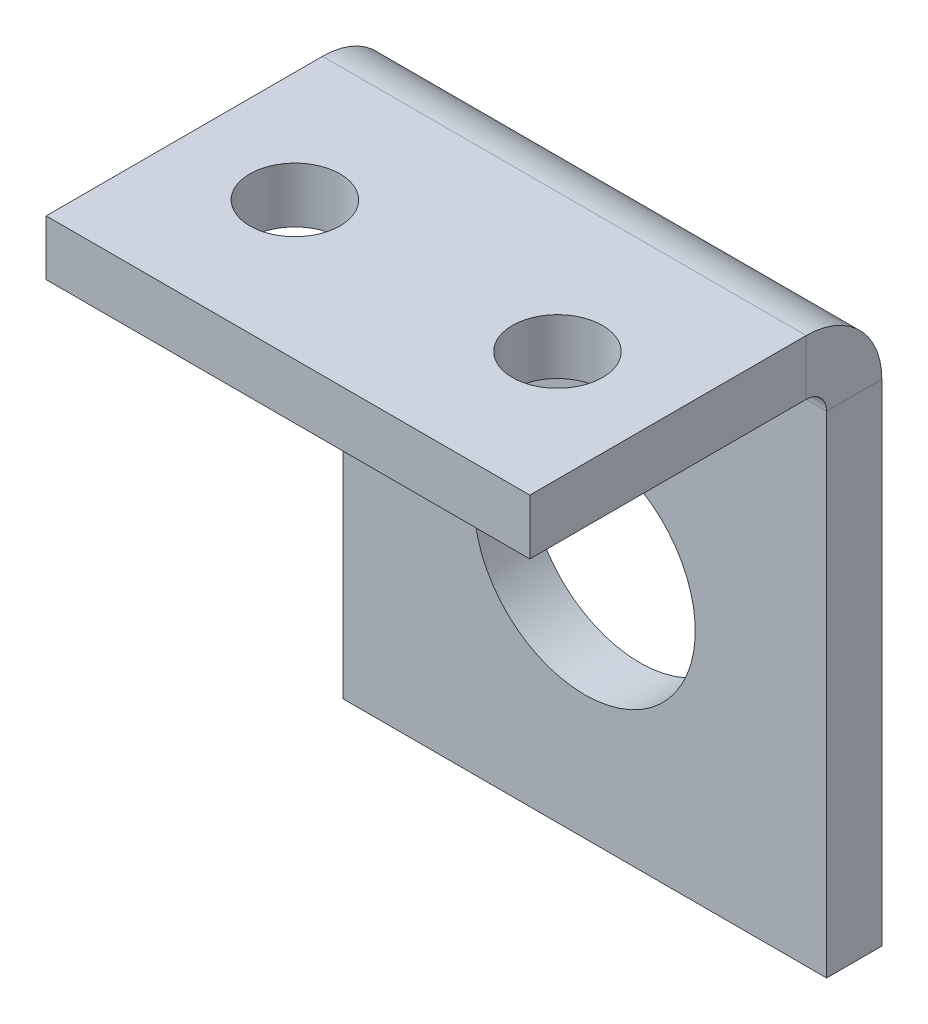
ISO-10303-21;
HEADER;
FILE_DESCRIPTION(('STEP AP214'),'2;1');
FILE_NAME('part.step','',(''),(''),'','','');
FILE_SCHEMA(('AUTOMOTIVE_DESIGN { 1 0 10303 214 1 1 1 1 }'));
ENDSEC;
DATA;
#1=APPLICATION_CONTEXT('core data for automotive mechanical design processes');
#2=APPLICATION_PROTOCOL_DEFINITION('international standard','automotive_design',2000,#1);
#3=PRODUCT_CONTEXT('',#1,'mechanical');
#4=PRODUCT('Part','Part','',(#3));
#5=PRODUCT_RELATED_PRODUCT_CATEGORY('part','',(#4));
#6=PRODUCT_DEFINITION_FORMATION('','',#4);
#7=PRODUCT_DEFINITION_CONTEXT('part definition',#1,'design');
#8=PRODUCT_DEFINITION('design','',#6,#7);
#9=PRODUCT_DEFINITION_SHAPE('','',#8);
#10=(LENGTH_UNIT() NAMED_UNIT(*) SI_UNIT(.MILLI.,.METRE.));
#11=(NAMED_UNIT(*) PLANE_ANGLE_UNIT() SI_UNIT($,.RADIAN.));
#12=(NAMED_UNIT(*) SI_UNIT($,.STERADIAN.) SOLID_ANGLE_UNIT());
#13=UNCERTAINTY_MEASURE_WITH_UNIT(LENGTH_MEASURE(1.E-05),#10,'distance_accuracy_value','');
#14=(GEOMETRIC_REPRESENTATION_CONTEXT(3) GLOBAL_UNCERTAINTY_ASSIGNED_CONTEXT((#13)) GLOBAL_UNIT_ASSIGNED_CONTEXT((#10,
#11,#12)) REPRESENTATION_CONTEXT('',''));
#15=CARTESIAN_POINT('',(0.,0.,0.));
#16=DIRECTION('',(0.,0.,1.));
#17=DIRECTION('',(1.,0.,0.));
#18=AXIS2_PLACEMENT_3D('',#15,#16,#17);
#19=CARTESIAN_POINT('',(0.,0.,0.));
#20=DIRECTION('',(0.,1.,0.));
#21=DIRECTION('',(0.,0.,1.));
#22=AXIS2_PLACEMENT_3D('',#19,#20,#21);
#23=PLANE('',#22);
#24=CARTESIAN_POINT('',(-19.2867132867133,0.,-16.3298368298368));
#25=DIRECTION('',(0.,1.,0.));
#26=DIRECTION('',(0.,0.,1.));
#27=AXIS2_PLACEMENT_3D('',#24,#25,#26);
#28=CIRCLE('',#27,1.63195);
#29=CARTESIAN_POINT('',(-19.2867132867133,0.,-14.6978868298368));
#30=VERTEX_POINT('',#29);
#31=EDGE_CURVE('E160',#30,#30,#28,.F.);
#32=ORIENTED_EDGE('',*,*,#31,.T.);
#33=EDGE_LOOP('',(#32));
#34=FACE_BOUND('',#33,.T.);
#35=DIRECTION('',(0.,0.,1.));
#36=VECTOR('',#35,1.);
#37=CARTESIAN_POINT('',(-23.2867132867133,0.,-21.3298368298368));
#38=LINE('',#37,#36);
#39=CARTESIAN_POINT('',(-23.2867132867133,0.,-21.3298368298368));
#40=VERTEX_POINT('',#39);
#41=CARTESIAN_POINT('',(-23.2867132867133,0.,-11.3298368298368));
#42=VERTEX_POINT('',#41);
#43=EDGE_CURVE('E124',#40,#42,#38,.T.);
#44=ORIENTED_EDGE('',*,*,#43,.T.);
#45=DIRECTION('',(1.,0.,0.));
#46=VECTOR('',#45,1.);
#47=CARTESIAN_POINT('',(-23.2867132867133,0.,-11.3298368298368));
#48=LINE('',#47,#46);
#49=CARTESIAN_POINT('',(-5.78671328671329,0.,-11.3298368298368));
#50=VERTEX_POINT('',#49);
#51=EDGE_CURVE('E127',#42,#50,#48,.T.);
#52=ORIENTED_EDGE('',*,*,#51,.T.);
#53=DIRECTION('',(0.,0.,-1.));
#54=VECTOR('',#53,1.);
#55=CARTESIAN_POINT('',(-5.78671328671329,0.,-21.3298368298368));
#56=LINE('',#55,#54);
#57=CARTESIAN_POINT('',(-5.78671328671329,0.,-21.3298368298368));
#58=VERTEX_POINT('',#57);
#59=EDGE_CURVE('E132',#50,#58,#56,.T.);
#60=ORIENTED_EDGE('',*,*,#59,.T.);
#61=DIRECTION('',(-1.,0.,0.));
#62=VECTOR('',#61,1.);
#63=CARTESIAN_POINT('',(-23.2867132867133,0.,-21.3298368298368));
#64=LINE('',#63,#62);
#65=EDGE_CURVE('E102',#58,#40,#64,.T.);
#66=ORIENTED_EDGE('',*,*,#65,.T.);
#67=EDGE_LOOP('',(#44,#52,#60,#66));
#68=FACE_BOUND('',#67,.T.);
#69=CARTESIAN_POINT('',(-9.78671328671328,0.,-16.3298368298368));
#70=DIRECTION('',(0.,1.,0.));
#71=DIRECTION('',(0.,0.,1.));
#72=AXIS2_PLACEMENT_3D('',#69,#70,#71);
#73=CIRCLE('',#72,1.63195);
#74=CARTESIAN_POINT('',(-9.78671328671328,0.,-14.6978868298368));
#75=VERTEX_POINT('',#74);
#76=EDGE_CURVE('E128',#75,#75,#73,.F.);
#77=ORIENTED_EDGE('',*,*,#76,.T.);
#78=EDGE_LOOP('',(#77));
#79=FACE_BOUND('',#78,.T.);
#80=ADVANCED_FACE('F61',(#34,#68,#79),#23,.T.);
#81=CARTESIAN_POINT('',(-23.2867132867133,-2.,-21.3298368298368));
#82=DIRECTION('',(-1.,0.,0.));
#83=DIRECTION('',(0.,0.,1.));
#84=AXIS2_PLACEMENT_3D('',#81,#82,#83);
#85=PLANE('',#84);
#86=ORIENTED_EDGE('',*,*,#43,.F.);
#87=DIRECTION('',(0.,1.,0.));
#88=VECTOR('',#87,1.);
#89=CARTESIAN_POINT('',(-23.2867132867133,-2.,-21.3298368298368));
#90=LINE('',#89,#88);
#91=CARTESIAN_POINT('',(-23.2867132867133,-2.,-21.3298368298368));
#92=VERTEX_POINT('',#91);
#93=EDGE_CURVE('E13',#92,#40,#90,.T.);
#94=ORIENTED_EDGE('',*,*,#93,.F.);
#95=DIRECTION('',(0.,0.,1.));
#96=VECTOR('',#95,1.);
#97=CARTESIAN_POINT('',(-23.2867132867133,-2.,-21.3298368298368));
#98=LINE('',#97,#96);
#99=CARTESIAN_POINT('',(-23.2867132867133,-2.,-11.3298368298368));
#100=VERTEX_POINT('',#99);
#101=EDGE_CURVE('E133',#92,#100,#98,.T.);
#102=ORIENTED_EDGE('',*,*,#101,.T.);
#103=DIRECTION('',(0.,1.,0.));
#104=VECTOR('',#103,1.);
#105=CARTESIAN_POINT('',(-23.2867132867133,-2.,-11.3298368298368));
#106=LINE('',#105,#104);
#107=EDGE_CURVE('E65',#100,#42,#106,.T.);
#108=ORIENTED_EDGE('',*,*,#107,.T.);
#109=EDGE_LOOP('',(#86,#94,#102,#108));
#110=FACE_BOUND('',#109,.T.);
#111=ADVANCED_FACE('F63',(#110),#85,.T.);
#112=CARTESIAN_POINT('',(-5.78671328671329,-2.,-21.3298368298368));
#113=DIRECTION('',(1.,0.,0.));
#114=DIRECTION('',(0.,0.,-1.));
#115=AXIS2_PLACEMENT_3D('',#112,#113,#114);
#116=PLANE('',#115);
#117=ORIENTED_EDGE('',*,*,#59,.F.);
#118=DIRECTION('',(0.,1.,0.));
#119=VECTOR('',#118,1.);
#120=CARTESIAN_POINT('',(-5.78671328671329,-2.,-11.3298368298368));
#121=LINE('',#120,#119);
#122=CARTESIAN_POINT('',(-5.78671328671329,-2.,-11.3298368298368));
#123=VERTEX_POINT('',#122);
#124=EDGE_CURVE('E80',#123,#50,#121,.T.);
#125=ORIENTED_EDGE('',*,*,#124,.F.);
#126=DIRECTION('',(0.,0.,-1.));
#127=VECTOR('',#126,1.);
#128=CARTESIAN_POINT('',(-5.78671328671329,-2.,-21.3298368298368));
#129=LINE('',#128,#127);
#130=CARTESIAN_POINT('',(-5.78671328671329,-2.,-21.3298368298368));
#131=VERTEX_POINT('',#130);
#132=EDGE_CURVE('E143',#123,#131,#129,.T.);
#133=ORIENTED_EDGE('',*,*,#132,.T.);
#134=DIRECTION('',(0.,1.,0.));
#135=VECTOR('',#134,1.);
#136=CARTESIAN_POINT('',(-5.78671328671329,-2.,-21.3298368298368));
#137=LINE('',#136,#135);
#138=EDGE_CURVE('E71',#131,#58,#137,.T.);
#139=ORIENTED_EDGE('',*,*,#138,.T.);
#140=EDGE_LOOP('',(#117,#125,#133,#139));
#141=FACE_BOUND('',#140,.T.);
#142=ADVANCED_FACE('F255',(#141),#116,.T.);
#143=CARTESIAN_POINT('',(-23.2867132867133,-2.,-11.3298368298368));
#144=DIRECTION('',(0.,0.,1.));
#145=DIRECTION('',(1.,0.,0.));
#146=AXIS2_PLACEMENT_3D('',#143,#144,#145);
#147=PLANE('',#146);
#148=ORIENTED_EDGE('',*,*,#51,.F.);
#149=ORIENTED_EDGE('',*,*,#107,.F.);
#150=DIRECTION('',(1.,0.,0.));
#151=VECTOR('',#150,1.);
#152=CARTESIAN_POINT('',(-23.2867132867133,-2.,-11.3298368298368));
#153=LINE('',#152,#151);
#154=EDGE_CURVE('E135',#100,#123,#153,.T.);
#155=ORIENTED_EDGE('',*,*,#154,.T.);
#156=ORIENTED_EDGE('',*,*,#124,.T.);
#157=EDGE_LOOP('',(#148,#149,#155,#156));
#158=FACE_BOUND('',#157,.T.);
#159=ADVANCED_FACE('F150',(#158),#147,.T.);
#160=CARTESIAN_POINT('',(0.,-2.,0.));
#161=DIRECTION('',(0.,1.,0.));
#162=DIRECTION('',(0.,0.,1.));
#163=AXIS2_PLACEMENT_3D('',#160,#161,#162);
#164=PLANE('',#163);
#165=CARTESIAN_POINT('',(-19.2867132867133,-2.,-16.3298368298368));
#166=DIRECTION('',(0.,-1.,0.));
#167=DIRECTION('',(0.,0.,-1.));
#168=AXIS2_PLACEMENT_3D('',#165,#166,#167);
#169=CIRCLE('',#168,1.63195);
#170=CARTESIAN_POINT('',(-19.2867132867133,-2.,-17.9617868298368));
#171=VERTEX_POINT('',#170);
#172=EDGE_CURVE('E110',#171,#171,#169,.T.);
#173=ORIENTED_EDGE('',*,*,#172,.F.);
#174=EDGE_LOOP('',(#173));
#175=FACE_BOUND('',#174,.T.);
#176=CARTESIAN_POINT('',(-9.78671328671328,-2.,-16.3298368298368));
#177=DIRECTION('',(0.,-1.,0.));
#178=DIRECTION('',(0.,0.,-1.));
#179=AXIS2_PLACEMENT_3D('',#176,#177,#178);
#180=CIRCLE('',#179,1.63195);
#181=CARTESIAN_POINT('',(-9.78671328671328,-2.,-17.9617868298368));
#182=VERTEX_POINT('',#181);
#183=EDGE_CURVE('E157',#182,#182,#180,.T.);
#184=ORIENTED_EDGE('',*,*,#183,.F.);
#185=EDGE_LOOP('',(#184));
#186=FACE_BOUND('',#185,.T.);
#187=ORIENTED_EDGE('',*,*,#101,.F.);
#188=DIRECTION('',(-1.,0.,0.));
#189=VECTOR('',#188,1.);
#190=CARTESIAN_POINT('',(-23.2867132867133,-2.,-21.3298368298368));
#191=LINE('',#190,#189);
#192=EDGE_CURVE('E141',#131,#92,#191,.T.);
#193=ORIENTED_EDGE('',*,*,#192,.F.);
#194=ORIENTED_EDGE('',*,*,#132,.F.);
#195=ORIENTED_EDGE('',*,*,#154,.F.);
#196=EDGE_LOOP('',(#187,#193,#194,#195));
#197=FACE_BOUND('',#196,.T.);
#198=ADVANCED_FACE('F153',(#175,#186,#197),#164,.F.);
#199=CARTESIAN_POINT('',(-9.78671328671328,-2.,-16.3298368298368));
#200=DIRECTION('',(0.,-1.,0.));
#201=DIRECTION('',(0.,0.,-1.));
#202=AXIS2_PLACEMENT_3D('',#199,#200,#201);
#203=CYLINDRICAL_SURFACE('',#202,1.63195);
#204=ORIENTED_EDGE('',*,*,#76,.F.);
#205=EDGE_LOOP('',(#204));
#206=FACE_BOUND('',#205,.T.);
#207=ORIENTED_EDGE('',*,*,#183,.T.);
#208=EDGE_LOOP('',(#207));
#209=FACE_BOUND('',#208,.T.);
#210=ADVANCED_FACE('F271',(#206,#209),#203,.F.);
#211=CARTESIAN_POINT('',(-19.2867132867133,-2.,-16.3298368298368));
#212=DIRECTION('',(0.,-1.,0.));
#213=DIRECTION('',(0.,0.,-1.));
#214=AXIS2_PLACEMENT_3D('',#211,#212,#213);
#215=CYLINDRICAL_SURFACE('',#214,1.63195);
#216=ORIENTED_EDGE('',*,*,#31,.F.);
#217=EDGE_LOOP('',(#216));
#218=FACE_BOUND('',#217,.T.);
#219=ORIENTED_EDGE('',*,*,#172,.T.);
#220=EDGE_LOOP('',(#219));
#221=FACE_BOUND('',#220,.T.);
#222=ADVANCED_FACE('F275',(#218,#221),#215,.F.);
#223=CARTESIAN_POINT('',(-23.2867132867133,-2.7366,-21.3298368298368));
#224=DIRECTION('',(-1.,0.,0.));
#225=DIRECTION('',(0.,0.,1.));
#226=AXIS2_PLACEMENT_3D('',#223,#224,#225);
#227=PLANE('',#226);
#228=DIRECTION('',(0.,0.,1.));
#229=VECTOR('',#228,1.);
#230=CARTESIAN_POINT('',(-23.2867132867133,-2.73659999999999,-24.0664368298368));
#231=LINE('',#230,#229);
#232=CARTESIAN_POINT('',(-23.2867132867133,-2.7366,-22.0664368298368));
#233=VERTEX_POINT('',#232);
#234=CARTESIAN_POINT('',(-23.2867132867133,-2.73659999999999,-24.0664368298368));
#235=VERTEX_POINT('',#234);
#236=EDGE_CURVE('E170',#233,#235,#231,.F.);
#237=ORIENTED_EDGE('',*,*,#236,.F.);
#238=CARTESIAN_POINT('',(-23.2867132867133,-2.7366,-21.3298368298368));
#239=DIRECTION('',(1.,0.,0.));
#240=DIRECTION('',(0.,0.,-1.));
#241=AXIS2_PLACEMENT_3D('',#238,#239,#240);
#242=CIRCLE('',#241,0.7366);
#243=EDGE_CURVE('E119',#92,#233,#242,.F.);
#244=ORIENTED_EDGE('',*,*,#243,.F.);
#245=ORIENTED_EDGE('',*,*,#93,.T.);
#246=CARTESIAN_POINT('',(-23.2867132867133,-2.7366,-21.3298368298368));
#247=DIRECTION('',(1.,0.,0.));
#248=DIRECTION('',(0.,0.,-1.));
#249=AXIS2_PLACEMENT_3D('',#246,#247,#248);
#250=CIRCLE('',#249,2.7366);
#251=EDGE_CURVE('E98',#40,#235,#250,.F.);
#252=ORIENTED_EDGE('',*,*,#251,.T.);
#253=EDGE_LOOP('',(#237,#244,#245,#252));
#254=FACE_BOUND('',#253,.T.);
#255=ADVANCED_FACE('F116',(#254),#227,.T.);
#256=CARTESIAN_POINT('',(-5.78671328671329,-2.7366,-21.3298368298368));
#257=DIRECTION('',(-1.,0.,0.));
#258=DIRECTION('',(0.,0.,1.));
#259=AXIS2_PLACEMENT_3D('',#256,#257,#258);
#260=PLANE('',#259);
#261=CARTESIAN_POINT('',(-5.78671328671329,-2.7366,-21.3298368298368));
#262=DIRECTION('',(1.,0.,0.));
#263=DIRECTION('',(0.,0.,-1.));
#264=AXIS2_PLACEMENT_3D('',#261,#262,#263);
#265=CIRCLE('',#264,0.7366);
#266=CARTESIAN_POINT('',(-5.78671328671329,-2.7366,-22.0664368298368));
#267=VERTEX_POINT('',#266);
#268=EDGE_CURVE('E165',#267,#131,#265,.T.);
#269=ORIENTED_EDGE('',*,*,#268,.F.);
#270=DIRECTION('',(0.,0.,1.));
#271=VECTOR('',#270,1.);
#272=CARTESIAN_POINT('',(-5.78671328671329,-2.7366,-22.0664368298368));
#273=LINE('',#272,#271);
#274=CARTESIAN_POINT('',(-5.78671328671329,-2.73659999999999,-24.0664368298368));
#275=VERTEX_POINT('',#274);
#276=EDGE_CURVE('E176',#267,#275,#273,.F.);
#277=ORIENTED_EDGE('',*,*,#276,.T.);
#278=CARTESIAN_POINT('',(-5.78671328671329,-2.7366,-21.3298368298368));
#279=DIRECTION('',(1.,0.,0.));
#280=DIRECTION('',(0.,0.,-1.));
#281=AXIS2_PLACEMENT_3D('',#278,#279,#280);
#282=CIRCLE('',#281,2.7366);
#283=EDGE_CURVE('E111',#275,#58,#282,.T.);
#284=ORIENTED_EDGE('',*,*,#283,.T.);
#285=ORIENTED_EDGE('',*,*,#138,.F.);
#286=EDGE_LOOP('',(#269,#277,#284,#285));
#287=FACE_BOUND('',#286,.T.);
#288=ADVANCED_FACE('F254',(#287),#260,.F.);
#289=CARTESIAN_POINT('',(-5.78671328671329,-2.7366,-21.3298368298368));
#290=DIRECTION('',(1.,0.,0.));
#291=DIRECTION('',(0.,0.,-1.));
#292=AXIS2_PLACEMENT_3D('',#289,#290,#291);
#293=CYLINDRICAL_SURFACE('',#292,2.7366);
#294=ORIENTED_EDGE('',*,*,#65,.F.);
#295=ORIENTED_EDGE('',*,*,#283,.F.);
#296=DIRECTION('',(1.,0.,0.));
#297=VECTOR('',#296,1.);
#298=CARTESIAN_POINT('',(-23.2867132867133,-2.73659999999999,-24.0664368298368));
#299=LINE('',#298,#297);
#300=EDGE_CURVE('E106',#275,#235,#299,.F.);
#301=ORIENTED_EDGE('',*,*,#300,.T.);
#302=ORIENTED_EDGE('',*,*,#251,.F.);
#303=EDGE_LOOP('',(#294,#295,#301,#302));
#304=FACE_BOUND('',#303,.T.);
#305=ADVANCED_FACE('F99',(#304),#293,.T.);
#306=CARTESIAN_POINT('',(-5.78671328671329,-2.7366,-21.3298368298368));
#307=DIRECTION('',(1.,0.,0.));
#308=DIRECTION('',(0.,0.,-1.));
#309=AXIS2_PLACEMENT_3D('',#306,#307,#308);
#310=CYLINDRICAL_SURFACE('',#309,0.7366);
#311=ORIENTED_EDGE('',*,*,#192,.T.);
#312=ORIENTED_EDGE('',*,*,#243,.T.);
#313=DIRECTION('',(1.,0.,0.));
#314=VECTOR('',#313,1.);
#315=CARTESIAN_POINT('',(-23.2867132867133,-2.7366,-22.0664368298368));
#316=LINE('',#315,#314);
#317=EDGE_CURVE('E172',#233,#267,#316,.T.);
#318=ORIENTED_EDGE('',*,*,#317,.T.);
#319=ORIENTED_EDGE('',*,*,#268,.T.);
#320=EDGE_LOOP('',(#311,#312,#318,#319));
#321=FACE_BOUND('',#320,.T.);
#322=ADVANCED_FACE('F250',(#321),#310,.F.);
#323=CARTESIAN_POINT('',(-5.78671328671329,-20.5,-24.0664368298369));
#324=DIRECTION('',(-1.,0.,0.));
#325=DIRECTION('',(0.,0.,1.));
#326=AXIS2_PLACEMENT_3D('',#323,#324,#325);
#327=PLANE('',#326);
#328=ORIENTED_EDGE('',*,*,#276,.F.);
#329=DIRECTION('',(0.,1.,0.));
#330=VECTOR('',#329,1.);
#331=CARTESIAN_POINT('',(-5.78671328671329,-20.5,-22.0664368298369));
#332=LINE('',#331,#330);
#333=CARTESIAN_POINT('',(-5.78671328671329,-20.5,-22.0664368298369));
#334=VERTEX_POINT('',#333);
#335=EDGE_CURVE('E180',#267,#334,#332,.F.);
#336=ORIENTED_EDGE('',*,*,#335,.T.);
#337=DIRECTION('',(0.,0.,1.));
#338=VECTOR('',#337,1.);
#339=CARTESIAN_POINT('',(-5.78671328671329,-20.5,-24.0664368298369));
#340=LINE('',#339,#338);
#341=CARTESIAN_POINT('',(-5.78671328671329,-20.5,-24.0664368298369));
#342=VERTEX_POINT('',#341);
#343=EDGE_CURVE('E167',#342,#334,#340,.T.);
#344=ORIENTED_EDGE('',*,*,#343,.F.);
#345=DIRECTION('',(0.,-1.,0.));
#346=VECTOR('',#345,1.);
#347=CARTESIAN_POINT('',(-5.78671328671329,0.,-24.0664368298368));
#348=LINE('',#347,#346);
#349=EDGE_CURVE('E189',#275,#342,#348,.T.);
#350=ORIENTED_EDGE('',*,*,#349,.F.);
#351=EDGE_LOOP('',(#328,#336,#344,#350));
#352=FACE_BOUND('',#351,.T.);
#353=ADVANCED_FACE('F228',(#352),#327,.F.);
#354=CARTESIAN_POINT('',(-23.2867132867133,-1.99999999999999,-24.0664368298368));
#355=DIRECTION('',(1.,0.,0.));
#356=DIRECTION('',(0.,0.,-1.));
#357=AXIS2_PLACEMENT_3D('',#354,#355,#356);
#358=PLANE('',#357);
#359=ORIENTED_EDGE('',*,*,#236,.T.);
#360=DIRECTION('',(0.,1.,0.));
#361=VECTOR('',#360,1.);
#362=CARTESIAN_POINT('',(-23.2867132867133,0.,-24.0664368298368));
#363=LINE('',#362,#361);
#364=CARTESIAN_POINT('',(-23.2867132867133,-20.5,-24.0664368298369));
#365=VERTEX_POINT('',#364);
#366=EDGE_CURVE('E195',#365,#235,#363,.T.);
#367=ORIENTED_EDGE('',*,*,#366,.F.);
#368=DIRECTION('',(0.,0.,1.));
#369=VECTOR('',#368,1.);
#370=CARTESIAN_POINT('',(-23.2867132867133,-20.5,-24.0664368298369));
#371=LINE('',#370,#369);
#372=CARTESIAN_POINT('',(-23.2867132867133,-20.5,-22.0664368298369));
#373=VERTEX_POINT('',#372);
#374=EDGE_CURVE('E198',#365,#373,#371,.T.);
#375=ORIENTED_EDGE('',*,*,#374,.T.);
#376=DIRECTION('',(0.,-1.,0.));
#377=VECTOR('',#376,1.);
#378=CARTESIAN_POINT('',(-23.2867132867133,-2.,-22.0664368298368));
#379=LINE('',#378,#377);
#380=EDGE_CURVE('E186',#373,#233,#379,.F.);
#381=ORIENTED_EDGE('',*,*,#380,.T.);
#382=EDGE_LOOP('',(#359,#367,#375,#381));
#383=FACE_BOUND('',#382,.T.);
#384=ADVANCED_FACE('F216',(#383),#358,.F.);
#385=CARTESIAN_POINT('',(0.,0.,-24.0664368298368));
#386=DIRECTION('',(0.,0.,1.));
#387=DIRECTION('',(0.,-1.,0.));
#388=AXIS2_PLACEMENT_3D('',#385,#386,#387);
#389=PLANE('',#388);
#390=CARTESIAN_POINT('',(-14.5367132867133,-12.,-24.0664368298369));
#391=DIRECTION('',(0.,0.,-1.));
#392=DIRECTION('',(0.,1.,0.));
#393=AXIS2_PLACEMENT_3D('',#390,#391,#392);
#394=CIRCLE('',#393,4.);
#395=CARTESIAN_POINT('',(-14.5367132867133,-7.99999999999995,-24.0664368298368));
#396=VERTEX_POINT('',#395);
#397=EDGE_CURVE('E205',#396,#396,#394,.T.);
#398=ORIENTED_EDGE('',*,*,#397,.F.);
#399=EDGE_LOOP('',(#398));
#400=FACE_BOUND('',#399,.T.);
#401=ORIENTED_EDGE('',*,*,#300,.F.);
#402=ORIENTED_EDGE('',*,*,#349,.T.);
#403=DIRECTION('',(-1.,0.,0.));
#404=VECTOR('',#403,1.);
#405=CARTESIAN_POINT('',(0.,-20.5,-24.0664368298369));
#406=LINE('',#405,#404);
#407=EDGE_CURVE('E192',#342,#365,#406,.T.);
#408=ORIENTED_EDGE('',*,*,#407,.T.);
#409=ORIENTED_EDGE('',*,*,#366,.T.);
#410=EDGE_LOOP('',(#401,#402,#408,#409));
#411=FACE_BOUND('',#410,.T.);
#412=ADVANCED_FACE('F212',(#400,#411),#389,.F.);
#413=CARTESIAN_POINT('',(0.,0.,-22.0664368298368));
#414=DIRECTION('',(0.,0.,1.));
#415=DIRECTION('',(0.,-1.,0.));
#416=AXIS2_PLACEMENT_3D('',#413,#414,#415);
#417=PLANE('',#416);
#418=CARTESIAN_POINT('',(-14.5367132867133,-12.,-22.0664368298369));
#419=DIRECTION('',(0.,0.,1.));
#420=DIRECTION('',(0.,-1.,0.));
#421=AXIS2_PLACEMENT_3D('',#418,#419,#420);
#422=CIRCLE('',#421,4.);
#423=CARTESIAN_POINT('',(-14.5367132867133,-16.,-22.0664368298369));
#424=VERTEX_POINT('',#423);
#425=EDGE_CURVE('E173',#424,#424,#422,.F.);
#426=ORIENTED_EDGE('',*,*,#425,.T.);
#427=EDGE_LOOP('',(#426));
#428=FACE_BOUND('',#427,.T.);
#429=ORIENTED_EDGE('',*,*,#335,.F.);
#430=ORIENTED_EDGE('',*,*,#317,.F.);
#431=ORIENTED_EDGE('',*,*,#380,.F.);
#432=DIRECTION('',(1.,0.,0.));
#433=VECTOR('',#432,1.);
#434=CARTESIAN_POINT('',(-23.2867132867133,-20.5,-22.0664368298369));
#435=LINE('',#434,#433);
#436=EDGE_CURVE('E183',#334,#373,#435,.F.);
#437=ORIENTED_EDGE('',*,*,#436,.F.);
#438=EDGE_LOOP('',(#429,#430,#431,#437));
#439=FACE_BOUND('',#438,.T.);
#440=ADVANCED_FACE('F215',(#428,#439),#417,.T.);
#441=CARTESIAN_POINT('',(-23.2867132867133,-20.5,-24.0664368298369));
#442=DIRECTION('',(0.,1.,0.));
#443=DIRECTION('',(0.,0.,1.));
#444=AXIS2_PLACEMENT_3D('',#441,#442,#443);
#445=PLANE('',#444);
#446=ORIENTED_EDGE('',*,*,#436,.T.);
#447=ORIENTED_EDGE('',*,*,#374,.F.);
#448=ORIENTED_EDGE('',*,*,#407,.F.);
#449=ORIENTED_EDGE('',*,*,#343,.T.);
#450=EDGE_LOOP('',(#446,#447,#448,#449));
#451=FACE_BOUND('',#450,.T.);
#452=ADVANCED_FACE('F236',(#451),#445,.F.);
#453=CARTESIAN_POINT('',(-14.5367132867133,-12.,-10.7527283308521));
#454=DIRECTION('',(0.,0.,-1.));
#455=DIRECTION('',(0.,1.,0.));
#456=AXIS2_PLACEMENT_3D('',#453,#454,#455);
#457=CYLINDRICAL_SURFACE('',#456,4.);
#458=ORIENTED_EDGE('',*,*,#397,.T.);
#459=EDGE_LOOP('',(#458));
#460=FACE_BOUND('',#459,.T.);
#461=ORIENTED_EDGE('',*,*,#425,.F.);
#462=EDGE_LOOP('',(#461));
#463=FACE_BOUND('',#462,.T.);
#464=ADVANCED_FACE('F209',(#460,#463),#457,.F.);
#465=CLOSED_SHELL('',(#80,#111,#142,#159,#198,#210,#222,#255,#288,#305,#322,#353,#384,#412,#440,
#452,#464));
#466=MANIFOLD_SOLID_BREP('B2',#465);
#467=ADVANCED_BREP_SHAPE_REPRESENTATION('',(#18,#466),#14);
#468=SHAPE_DEFINITION_REPRESENTATION(#9,#467);
ENDSEC;
END-ISO-10303-21;
